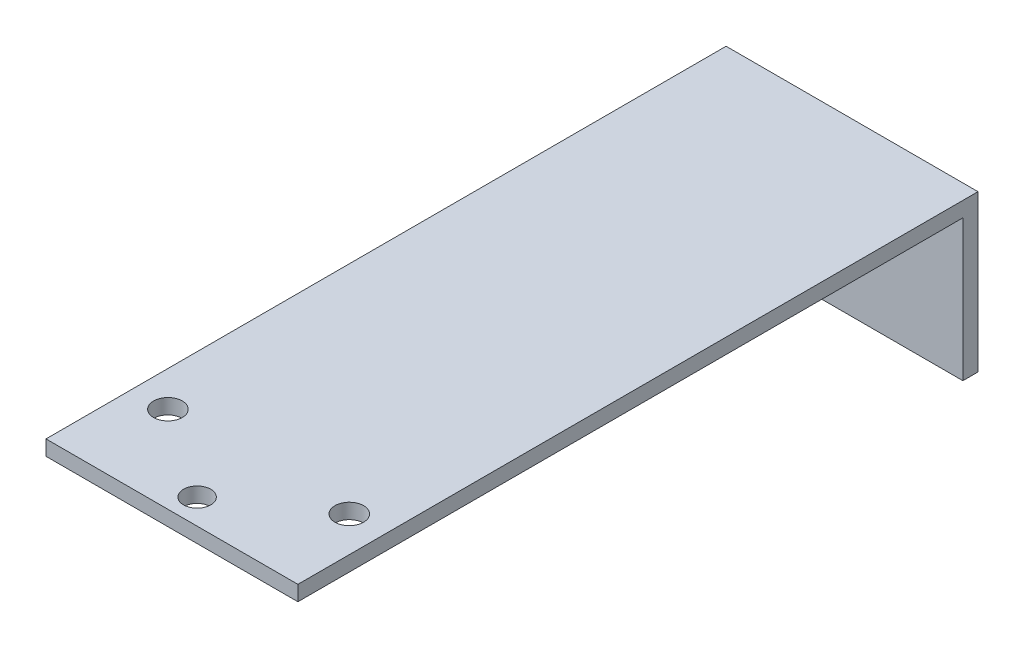
ISO-10303-21;
HEADER;
FILE_DESCRIPTION(('STEP AP214'),'2;1');
FILE_NAME('part.step','',(''),(''),'','','');
FILE_SCHEMA(('AUTOMOTIVE_DESIGN { 1 0 10303 214 1 1 1 1 }'));
ENDSEC;
DATA;
#1=APPLICATION_CONTEXT('core data for automotive mechanical design processes');
#2=APPLICATION_PROTOCOL_DEFINITION('international standard','automotive_design',2000,#1);
#3=PRODUCT_CONTEXT('',#1,'mechanical');
#4=PRODUCT('Part','Part','',(#3));
#5=PRODUCT_RELATED_PRODUCT_CATEGORY('part','',(#4));
#6=PRODUCT_DEFINITION_FORMATION('','',#4);
#7=PRODUCT_DEFINITION_CONTEXT('part definition',#1,'design');
#8=PRODUCT_DEFINITION('design','',#6,#7);
#9=PRODUCT_DEFINITION_SHAPE('','',#8);
#10=(LENGTH_UNIT() NAMED_UNIT(*) SI_UNIT(.MILLI.,.METRE.));
#11=(NAMED_UNIT(*) PLANE_ANGLE_UNIT() SI_UNIT($,.RADIAN.));
#12=(NAMED_UNIT(*) SI_UNIT($,.STERADIAN.) SOLID_ANGLE_UNIT());
#13=UNCERTAINTY_MEASURE_WITH_UNIT(LENGTH_MEASURE(1.E-05),#10,'distance_accuracy_value','');
#14=(GEOMETRIC_REPRESENTATION_CONTEXT(3) GLOBAL_UNCERTAINTY_ASSIGNED_CONTEXT((#13)) GLOBAL_UNIT_ASSIGNED_CONTEXT((#10,
#11,#12)) REPRESENTATION_CONTEXT('',''));
#15=CARTESIAN_POINT('',(0.,0.,0.));
#16=DIRECTION('',(0.,0.,1.));
#17=DIRECTION('',(1.,0.,0.));
#18=AXIS2_PLACEMENT_3D('',#15,#16,#17);
#19=CARTESIAN_POINT('',(0.,0.,0.));
#20=DIRECTION('',(0.,1.,0.));
#21=DIRECTION('',(0.,0.,1.));
#22=AXIS2_PLACEMENT_3D('',#19,#20,#21);
#23=PLANE('',#22);
#24=CARTESIAN_POINT('',(-40.4391805377721,0.,62.2878361075544));
#25=DIRECTION('',(0.,-1.,0.));
#26=DIRECTION('',(0.,0.,-1.));
#27=AXIS2_PLACEMENT_3D('',#24,#25,#26);
#28=CIRCLE('',#27,2.85);
#29=CARTESIAN_POINT('',(-40.4391805377721,0.,59.4378361075544));
#30=VERTEX_POINT('',#29);
#31=EDGE_CURVE('E151',#30,#30,#28,.T.);
#32=ORIENTED_EDGE('',*,*,#31,.F.);
#33=EDGE_LOOP('',(#32));
#34=FACE_BOUND('',#33,.T.);
#35=CARTESIAN_POINT('',(-4.43918053777207,0.,62.2878361075544));
#36=DIRECTION('',(0.,-1.,0.));
#37=DIRECTION('',(0.,0.,-1.));
#38=AXIS2_PLACEMENT_3D('',#35,#36,#37);
#39=CIRCLE('',#38,2.85);
#40=CARTESIAN_POINT('',(-4.43918053777207,0.,59.4378361075544));
#41=VERTEX_POINT('',#40);
#42=EDGE_CURVE('E156',#41,#41,#39,.T.);
#43=ORIENTED_EDGE('',*,*,#42,.F.);
#44=EDGE_LOOP('',(#43));
#45=FACE_BOUND('',#44,.T.);
#46=CARTESIAN_POINT('',(-22.4391805377721,0.,74.4878361075544));
#47=DIRECTION('',(0.,-1.,0.));
#48=DIRECTION('',(0.,0.,-1.));
#49=AXIS2_PLACEMENT_3D('',#46,#47,#48);
#50=CIRCLE('',#49,2.7);
#51=CARTESIAN_POINT('',(-22.4391805377721,0.,71.7878361075544));
#52=VERTEX_POINT('',#51);
#53=EDGE_CURVE('E126',#52,#52,#50,.T.);
#54=ORIENTED_EDGE('',*,*,#53,.F.);
#55=EDGE_LOOP('',(#54));
#56=FACE_BOUND('',#55,.T.);
#57=DIRECTION('',(-1.,0.,0.));
#58=VECTOR('',#57,1.);
#59=CARTESIAN_POINT('',(-47.4391805377721,0.,-52.5121638924456));
#60=LINE('',#59,#58);
#61=CARTESIAN_POINT('',(2.56081946222792,0.,-52.5121638924456));
#62=VERTEX_POINT('',#61);
#63=CARTESIAN_POINT('',(-47.4391805377721,0.,-52.5121638924456));
#64=VERTEX_POINT('',#63);
#65=EDGE_CURVE('E54',#62,#64,#60,.T.);
#66=ORIENTED_EDGE('',*,*,#65,.F.);
#67=DIRECTION('',(0.,0.,-1.));
#68=VECTOR('',#67,1.);
#69=CARTESIAN_POINT('',(2.56081946222791,0.,-55.5121638924456));
#70=LINE('',#69,#68);
#71=CARTESIAN_POINT('',(2.56081946222793,0.,79.4878361075544));
#72=VERTEX_POINT('',#71);
#73=EDGE_CURVE('E138',#72,#62,#70,.T.);
#74=ORIENTED_EDGE('',*,*,#73,.F.);
#75=DIRECTION('',(1.,0.,0.));
#76=VECTOR('',#75,1.);
#77=CARTESIAN_POINT('',(-47.4391805377721,0.,79.4878361075544));
#78=LINE('',#77,#76);
#79=CARTESIAN_POINT('',(-47.4391805377721,0.,79.4878361075544));
#80=VERTEX_POINT('',#79);
#81=EDGE_CURVE('E78',#80,#72,#78,.T.);
#82=ORIENTED_EDGE('',*,*,#81,.F.);
#83=DIRECTION('',(0.,0.,1.));
#84=VECTOR('',#83,1.);
#85=CARTESIAN_POINT('',(-47.4391805377721,0.,-55.5121638924456));
#86=LINE('',#85,#84);
#87=EDGE_CURVE('E136',#64,#80,#86,.T.);
#88=ORIENTED_EDGE('',*,*,#87,.F.);
#89=EDGE_LOOP('',(#66,#74,#82,#88));
#90=FACE_BOUND('',#89,.T.);
#91=ADVANCED_FACE('F37',(#34,#45,#56,#90),#23,.F.);
#92=CARTESIAN_POINT('',(-47.4391805377721,3.,-55.5121638924456));
#93=DIRECTION('',(1.,0.,0.));
#94=DIRECTION('',(0.,0.,-1.));
#95=AXIS2_PLACEMENT_3D('',#92,#93,#94);
#96=PLANE('',#95);
#97=DIRECTION('',(0.,-1.,0.));
#98=VECTOR('',#97,1.);
#99=CARTESIAN_POINT('',(-47.4391805377721,3.,-55.5121638924456));
#100=LINE('',#99,#98);
#101=CARTESIAN_POINT('',(-47.4391805377721,3.,-55.5121638924456));
#102=VERTEX_POINT('',#101);
#103=CARTESIAN_POINT('',(-47.4391805377721,-28.,-55.5121638924456));
#104=VERTEX_POINT('',#103);
#105=EDGE_CURVE('E100',#102,#104,#100,.T.);
#106=ORIENTED_EDGE('',*,*,#105,.T.);
#107=DIRECTION('',(0.,0.,-1.));
#108=VECTOR('',#107,1.);
#109=CARTESIAN_POINT('',(-47.4391805377721,-28.,-55.5121638924456));
#110=LINE('',#109,#108);
#111=CARTESIAN_POINT('',(-47.4391805377721,-28.,-52.5121638924456));
#112=VERTEX_POINT('',#111);
#113=EDGE_CURVE('E104',#112,#104,#110,.T.);
#114=ORIENTED_EDGE('',*,*,#113,.F.);
#115=DIRECTION('',(0.,1.,0.));
#116=VECTOR('',#115,1.);
#117=CARTESIAN_POINT('',(-47.4391805377721,-28.,-52.5121638924456));
#118=LINE('',#117,#116);
#119=EDGE_CURVE('E130',#112,#64,#118,.T.);
#120=ORIENTED_EDGE('',*,*,#119,.T.);
#121=ORIENTED_EDGE('',*,*,#87,.T.);
#122=DIRECTION('',(0.,-1.,0.));
#123=VECTOR('',#122,1.);
#124=CARTESIAN_POINT('',(-47.4391805377721,3.,79.4878361075544));
#125=LINE('',#124,#123);
#126=CARTESIAN_POINT('',(-47.4391805377721,3.,79.4878361075544));
#127=VERTEX_POINT('',#126);
#128=EDGE_CURVE('E11',#127,#80,#125,.T.);
#129=ORIENTED_EDGE('',*,*,#128,.F.);
#130=DIRECTION('',(0.,0.,1.));
#131=VECTOR('',#130,1.);
#132=CARTESIAN_POINT('',(-47.4391805377721,3.,-55.5121638924456));
#133=LINE('',#132,#131);
#134=EDGE_CURVE('E106',#102,#127,#133,.T.);
#135=ORIENTED_EDGE('',*,*,#134,.F.);
#136=EDGE_LOOP('',(#106,#114,#120,#121,#129,#135));
#137=FACE_BOUND('',#136,.T.);
#138=ADVANCED_FACE('F39',(#137),#96,.F.);
#139=CARTESIAN_POINT('',(-47.4391805377721,3.,79.4878361075544));
#140=DIRECTION('',(0.,0.,-1.));
#141=DIRECTION('',(-1.,0.,0.));
#142=AXIS2_PLACEMENT_3D('',#139,#140,#141);
#143=PLANE('',#142);
#144=ORIENTED_EDGE('',*,*,#81,.T.);
#145=DIRECTION('',(0.,-1.,0.));
#146=VECTOR('',#145,1.);
#147=CARTESIAN_POINT('',(2.56081946222793,3.,79.4878361075544));
#148=LINE('',#147,#146);
#149=CARTESIAN_POINT('',(2.56081946222793,3.,79.4878361075544));
#150=VERTEX_POINT('',#149);
#151=EDGE_CURVE('E46',#150,#72,#148,.T.);
#152=ORIENTED_EDGE('',*,*,#151,.F.);
#153=DIRECTION('',(1.,0.,0.));
#154=VECTOR('',#153,1.);
#155=CARTESIAN_POINT('',(-47.4391805377721,3.,79.4878361075544));
#156=LINE('',#155,#154);
#157=EDGE_CURVE('E83',#127,#150,#156,.T.);
#158=ORIENTED_EDGE('',*,*,#157,.F.);
#159=ORIENTED_EDGE('',*,*,#128,.T.);
#160=EDGE_LOOP('',(#144,#152,#158,#159));
#161=FACE_BOUND('',#160,.T.);
#162=ADVANCED_FACE('F197',(#161),#143,.F.);
#163=CARTESIAN_POINT('',(2.56081946222791,3.,-55.5121638924456));
#164=DIRECTION('',(-1.,0.,0.));
#165=DIRECTION('',(0.,0.,1.));
#166=AXIS2_PLACEMENT_3D('',#163,#164,#165);
#167=PLANE('',#166);
#168=ORIENTED_EDGE('',*,*,#73,.T.);
#169=DIRECTION('',(0.,1.,0.));
#170=VECTOR('',#169,1.);
#171=CARTESIAN_POINT('',(2.56081946222794,-28.,-52.5121638924456));
#172=LINE('',#171,#170);
#173=CARTESIAN_POINT('',(2.56081946222794,-28.,-52.5121638924456));
#174=VERTEX_POINT('',#173);
#175=EDGE_CURVE('E133',#174,#62,#172,.T.);
#176=ORIENTED_EDGE('',*,*,#175,.F.);
#177=DIRECTION('',(0.,0.,1.));
#178=VECTOR('',#177,1.);
#179=CARTESIAN_POINT('',(2.56081946222794,-28.,-55.5121638924456));
#180=LINE('',#179,#178);
#181=CARTESIAN_POINT('',(2.56081946222794,-28.,-55.5121638924456));
#182=VERTEX_POINT('',#181);
#183=EDGE_CURVE('E116',#182,#174,#180,.T.);
#184=ORIENTED_EDGE('',*,*,#183,.F.);
#185=DIRECTION('',(0.,-1.,0.));
#186=VECTOR('',#185,1.);
#187=CARTESIAN_POINT('',(2.56081946222791,3.,-55.5121638924456));
#188=LINE('',#187,#186);
#189=CARTESIAN_POINT('',(2.56081946222791,3.,-55.5121638924456));
#190=VERTEX_POINT('',#189);
#191=EDGE_CURVE('E108',#190,#182,#188,.T.);
#192=ORIENTED_EDGE('',*,*,#191,.F.);
#193=DIRECTION('',(0.,0.,-1.));
#194=VECTOR('',#193,1.);
#195=CARTESIAN_POINT('',(2.56081946222791,3.,-55.5121638924456));
#196=LINE('',#195,#194);
#197=EDGE_CURVE('E140',#150,#190,#196,.T.);
#198=ORIENTED_EDGE('',*,*,#197,.F.);
#199=ORIENTED_EDGE('',*,*,#151,.T.);
#200=EDGE_LOOP('',(#168,#176,#184,#192,#198,#199));
#201=FACE_BOUND('',#200,.T.);
#202=ADVANCED_FACE('F195',(#201),#167,.F.);
#203=CARTESIAN_POINT('',(-47.4391805377721,3.,-55.5121638924456));
#204=DIRECTION('',(0.,0.,1.));
#205=DIRECTION('',(1.,0.,0.));
#206=AXIS2_PLACEMENT_3D('',#203,#204,#205);
#207=PLANE('',#206);
#208=ORIENTED_EDGE('',*,*,#191,.T.);
#209=DIRECTION('',(1.,0.,0.));
#210=VECTOR('',#209,1.);
#211=CARTESIAN_POINT('',(-47.4391805377721,-28.,-55.5121638924456));
#212=LINE('',#211,#210);
#213=EDGE_CURVE('E111',#104,#182,#212,.T.);
#214=ORIENTED_EDGE('',*,*,#213,.F.);
#215=ORIENTED_EDGE('',*,*,#105,.F.);
#216=DIRECTION('',(-1.,0.,0.));
#217=VECTOR('',#216,1.);
#218=CARTESIAN_POINT('',(-47.4391805377721,3.,-55.5121638924456));
#219=LINE('',#218,#217);
#220=EDGE_CURVE('E63',#190,#102,#219,.T.);
#221=ORIENTED_EDGE('',*,*,#220,.F.);
#222=EDGE_LOOP('',(#208,#214,#215,#221));
#223=FACE_BOUND('',#222,.T.);
#224=ADVANCED_FACE('F112',(#223),#207,.F.);
#225=CARTESIAN_POINT('',(0.,3.,0.));
#226=DIRECTION('',(0.,1.,0.));
#227=DIRECTION('',(0.,0.,1.));
#228=AXIS2_PLACEMENT_3D('',#225,#226,#227);
#229=PLANE('',#228);
#230=CARTESIAN_POINT('',(-40.4391805377721,3.,62.2878361075544));
#231=DIRECTION('',(0.,1.,0.));
#232=DIRECTION('',(0.,0.,1.));
#233=AXIS2_PLACEMENT_3D('',#230,#231,#232);
#234=CIRCLE('',#233,2.85);
#235=CARTESIAN_POINT('',(-40.4391805377721,2.99999999999999,59.4378361075544));
#236=VERTEX_POINT('',#235);
#237=EDGE_CURVE('E41',#236,#236,#234,.T.);
#238=ORIENTED_EDGE('',*,*,#237,.F.);
#239=EDGE_LOOP('',(#238));
#240=FACE_BOUND('',#239,.T.);
#241=CARTESIAN_POINT('',(-4.43918053777207,3.,62.2878361075544));
#242=DIRECTION('',(0.,1.,0.));
#243=DIRECTION('',(0.,0.,1.));
#244=AXIS2_PLACEMENT_3D('',#241,#242,#243);
#245=CIRCLE('',#244,2.85);
#246=CARTESIAN_POINT('',(-4.43918053777207,2.99999999999999,59.4378361075544));
#247=VERTEX_POINT('',#246);
#248=EDGE_CURVE('E149',#247,#247,#245,.T.);
#249=ORIENTED_EDGE('',*,*,#248,.F.);
#250=EDGE_LOOP('',(#249));
#251=FACE_BOUND('',#250,.T.);
#252=CARTESIAN_POINT('',(-22.4391805377721,3.,74.4878361075544));
#253=DIRECTION('',(0.,1.,0.));
#254=DIRECTION('',(0.,0.,1.));
#255=AXIS2_PLACEMENT_3D('',#252,#253,#254);
#256=CIRCLE('',#255,2.7);
#257=CARTESIAN_POINT('',(-22.4391805377721,2.99999999999999,71.7878361075544));
#258=VERTEX_POINT('',#257);
#259=EDGE_CURVE('E123',#258,#258,#256,.T.);
#260=ORIENTED_EDGE('',*,*,#259,.F.);
#261=EDGE_LOOP('',(#260));
#262=FACE_BOUND('',#261,.T.);
#263=ORIENTED_EDGE('',*,*,#134,.T.);
#264=ORIENTED_EDGE('',*,*,#157,.T.);
#265=ORIENTED_EDGE('',*,*,#197,.T.);
#266=ORIENTED_EDGE('',*,*,#220,.T.);
#267=EDGE_LOOP('',(#263,#264,#265,#266));
#268=FACE_BOUND('',#267,.T.);
#269=ADVANCED_FACE('F188',(#240,#251,#262,#268),#229,.T.);
#270=CARTESIAN_POINT('',(-47.4391805377721,-28.,-52.5121638924456));
#271=DIRECTION('',(0.,0.,-1.));
#272=DIRECTION('',(-1.,0.,0.));
#273=AXIS2_PLACEMENT_3D('',#270,#271,#272);
#274=PLANE('',#273);
#275=ORIENTED_EDGE('',*,*,#65,.T.);
#276=ORIENTED_EDGE('',*,*,#119,.F.);
#277=DIRECTION('',(-1.,0.,0.));
#278=VECTOR('',#277,1.);
#279=CARTESIAN_POINT('',(-47.4391805377721,-28.,-52.5121638924456));
#280=LINE('',#279,#278);
#281=EDGE_CURVE('E120',#174,#112,#280,.T.);
#282=ORIENTED_EDGE('',*,*,#281,.F.);
#283=ORIENTED_EDGE('',*,*,#175,.T.);
#284=EDGE_LOOP('',(#275,#276,#282,#283));
#285=FACE_BOUND('',#284,.T.);
#286=ADVANCED_FACE('F182',(#285),#274,.F.);
#287=CARTESIAN_POINT('',(0.,-28.,0.));
#288=DIRECTION('',(0.,1.,0.));
#289=DIRECTION('',(0.,0.,1.));
#290=AXIS2_PLACEMENT_3D('',#287,#288,#289);
#291=PLANE('',#290);
#292=ORIENTED_EDGE('',*,*,#113,.T.);
#293=ORIENTED_EDGE('',*,*,#213,.T.);
#294=ORIENTED_EDGE('',*,*,#183,.T.);
#295=ORIENTED_EDGE('',*,*,#281,.T.);
#296=EDGE_LOOP('',(#292,#293,#294,#295));
#297=FACE_BOUND('',#296,.T.);
#298=ADVANCED_FACE('F118',(#297),#291,.F.);
#299=CARTESIAN_POINT('',(-22.4391805377721,90.,74.4878361075544));
#300=DIRECTION('',(0.,-1.,0.));
#301=DIRECTION('',(0.,0.,-1.));
#302=AXIS2_PLACEMENT_3D('',#299,#300,#301);
#303=CYLINDRICAL_SURFACE('',#302,2.7);
#304=CARTESIAN_POINT('',(-22.4391805377721,2.99999999999999,71.7878361075544));
#305=CARTESIAN_POINT('',(-22.4391805377721,2.96874999999999,71.7878361075544));
#306=CARTESIAN_POINT('',(-22.4391805377721,2.93749999999999,71.7878361075544));
#307=CARTESIAN_POINT('',(-22.4391805377721,2.87499999999999,71.7878361075544));
#308=CARTESIAN_POINT('',(-22.4391805377721,2.84374999999999,71.7878361075544));
#309=CARTESIAN_POINT('',(-22.4391805377721,2.78124999999999,71.7878361075544));
#310=CARTESIAN_POINT('',(-22.4391805377721,2.74999999999999,71.7878361075544));
#311=CARTESIAN_POINT('',(-22.4391805377721,2.68749999999999,71.7878361075544));
#312=CARTESIAN_POINT('',(-22.4391805377721,2.65624999999999,71.7878361075544));
#313=CARTESIAN_POINT('',(-22.4391805377721,2.59374999999999,71.7878361075544));
#314=CARTESIAN_POINT('',(-22.4391805377721,2.5625,71.7878361075544));
#315=CARTESIAN_POINT('',(-22.4391805377721,2.5,71.7878361075544));
#316=CARTESIAN_POINT('',(-22.4391805377721,2.46875,71.7878361075544));
#317=CARTESIAN_POINT('',(-22.4391805377721,2.40624999999999,71.7878361075544));
#318=CARTESIAN_POINT('',(-22.4391805377721,2.37499999999999,71.7878361075544));
#319=CARTESIAN_POINT('',(-22.4391805377721,2.31249999999999,71.7878361075544));
#320=CARTESIAN_POINT('',(-22.4391805377721,2.28124999999999,71.7878361075544));
#321=CARTESIAN_POINT('',(-22.4391805377721,2.21874999999999,71.7878361075544));
#322=CARTESIAN_POINT('',(-22.4391805377721,2.1875,71.7878361075544));
#323=CARTESIAN_POINT('',(-22.4391805377721,2.125,71.7878361075544));
#324=CARTESIAN_POINT('',(-22.4391805377721,2.09375,71.7878361075544));
#325=CARTESIAN_POINT('',(-22.4391805377721,2.03124999999999,71.7878361075544));
#326=CARTESIAN_POINT('',(-22.4391805377721,1.99999999999999,71.7878361075544));
#327=CARTESIAN_POINT('',(-22.4391805377721,1.93749999999999,71.7878361075544));
#328=CARTESIAN_POINT('',(-22.4391805377721,1.90625,71.7878361075544));
#329=CARTESIAN_POINT('',(-22.4391805377721,1.84375,71.7878361075544));
#330=CARTESIAN_POINT('',(-22.4391805377721,1.8125,71.7878361075544));
#331=CARTESIAN_POINT('',(-22.4391805377721,1.75,71.7878361075544));
#332=CARTESIAN_POINT('',(-22.4391805377721,1.71875,71.7878361075544));
#333=CARTESIAN_POINT('',(-22.4391805377721,1.65625,71.7878361075544));
#334=CARTESIAN_POINT('',(-22.4391805377721,1.625,71.7878361075544));
#335=CARTESIAN_POINT('',(-22.4391805377721,1.5625,71.7878361075544));
#336=CARTESIAN_POINT('',(-22.4391805377721,1.53125,71.7878361075544));
#337=CARTESIAN_POINT('',(-22.4391805377721,1.46875,71.7878361075544));
#338=CARTESIAN_POINT('',(-22.4391805377721,1.4375,71.7878361075544));
#339=CARTESIAN_POINT('',(-22.4391805377721,1.375,71.7878361075544));
#340=CARTESIAN_POINT('',(-22.4391805377721,1.34375,71.7878361075544));
#341=CARTESIAN_POINT('',(-22.4391805377721,1.28125000000001,71.7878361075544));
#342=CARTESIAN_POINT('',(-22.4391805377721,1.25000000000001,71.7878361075544));
#343=CARTESIAN_POINT('',(-22.4391805377721,1.1875,71.7878361075544));
#344=CARTESIAN_POINT('',(-22.4391805377721,1.15625,71.7878361075544));
#345=CARTESIAN_POINT('',(-22.4391805377721,1.09375,71.7878361075544));
#346=CARTESIAN_POINT('',(-22.4391805377721,1.06250000000001,71.7878361075544));
#347=CARTESIAN_POINT('',(-22.4391805377721,1.00000000000001,71.7878361075544));
#348=CARTESIAN_POINT('',(-22.4391805377721,0.968750000000009,71.7878361075544));
#349=CARTESIAN_POINT('',(-22.4391805377721,0.906250000000007,71.7878361075544));
#350=CARTESIAN_POINT('',(-22.4391805377721,0.875000000000005,71.7878361075544));
#351=CARTESIAN_POINT('',(-22.4391805377721,0.812500000000008,71.7878361075544));
#352=CARTESIAN_POINT('',(-22.4391805377721,0.781250000000011,71.7878361075544));
#353=CARTESIAN_POINT('',(-22.4391805377721,0.718750000000013,71.7878361075544));
#354=CARTESIAN_POINT('',(-22.4391805377721,0.687500000000012,71.7878361075544));
#355=CARTESIAN_POINT('',(-22.4391805377721,0.62500000000001,71.7878361075544));
#356=CARTESIAN_POINT('',(-22.4391805377721,0.593750000000009,71.7878361075544));
#357=CARTESIAN_POINT('',(-22.4391805377721,0.531250000000006,71.7878361075544));
#358=CARTESIAN_POINT('',(-22.4391805377721,0.500000000000005,71.7878361075544));
#359=CARTESIAN_POINT('',(-22.4391805377721,0.437500000000007,71.7878361075544));
#360=CARTESIAN_POINT('',(-22.4391805377721,0.406250000000011,71.7878361075544));
#361=CARTESIAN_POINT('',(-22.4391805377721,0.343750000000013,71.7878361075544));
#362=CARTESIAN_POINT('',(-22.4391805377721,0.312500000000012,71.7878361075544));
#363=CARTESIAN_POINT('',(-22.4391805377721,0.250000000000009,71.7878361075544));
#364=CARTESIAN_POINT('',(-22.4391805377721,0.218750000000008,71.7878361075544));
#365=CARTESIAN_POINT('',(-22.4391805377721,0.156250000000011,71.7878361075544));
#366=CARTESIAN_POINT('',(-22.4391805377721,0.125000000000014,71.7878361075544));
#367=CARTESIAN_POINT('',(-22.4391805377721,0.0625000000000162,71.7878361075544));
#368=CARTESIAN_POINT('',(-22.4391805377721,0.0312500000000151,71.7878361075544));
#369=CARTESIAN_POINT('',(-22.4391805377721,0.,71.7878361075544));
#370=B_SPLINE_CURVE_WITH_KNOTS('',3,(#304,#305,#306,#307,#308,#309,#310,#311,#312,#313,#314,
#315,#316,#317,#318,#319,#320,#321,#322,#323,#324,#325,#326,#327,#328,#329,#330,#331,#332,#333,
#334,#335,#336,#337,#338,#339,#340,#341,#342,#343,#344,#345,#346,#347,#348,#349,#350,#351,#352,
#353,#354,#355,#356,#357,#358,#359,#360,#361,#362,#363,#364,#365,#366,#367,#368,#369),
.UNSPECIFIED.,.F.,.F.,(4,2,2,2,2,2,2,2,2,2,2,2,2,2,2,2,2,2,2,2,2,2,2,2,2,2,2,2,2,2,2,2,4),(0.,
0.0937500000000036,0.187499999999993,0.281249999999997,0.375,0.46874999999999,0.562499999999994,
0.656249999999997,0.750000000000001,0.84374999999999,0.937499999999994,1.03125,1.12499999999999,
1.21874999999999,1.31249999999999,1.40624999999998,1.49999999999999,1.59374999999999,
1.68749999999998,1.78124999999998,1.87499999999999,1.96874999999998,2.06249999999998,
2.15624999999998,2.24999999999997,2.34374999999998,2.43749999999998,2.53124999999998,
2.62499999999997,2.71874999999998,2.81249999999998,2.90624999999997,2.99999999999998),.UNSPECIFIED.);
#371=EDGE_CURVE('BSEAM172',#258,#52,#370,.T.);
#372=ORIENTED_EDGE('',*,*,#259,.T.);
#373=ORIENTED_EDGE('',*,*,#53,.T.);
#374=ORIENTED_EDGE('',*,*,#371,.T.);
#375=ORIENTED_EDGE('',*,*,#371,.F.);
#376=EDGE_LOOP('',(#372,#374,#373,#375));
#377=FACE_BOUND('',#376,.T.);
#378=ADVANCED_FACE('F172',(#377),#303,.F.);
#379=CARTESIAN_POINT('',(-4.43918053777207,90.,62.2878361075544));
#380=DIRECTION('',(0.,-1.,0.));
#381=DIRECTION('',(0.,0.,-1.));
#382=AXIS2_PLACEMENT_3D('',#379,#380,#381);
#383=CYLINDRICAL_SURFACE('',#382,2.85);
#384=CARTESIAN_POINT('',(-4.43918053777207,2.99999999999999,59.4378361075544));
#385=CARTESIAN_POINT('',(-4.43918053777207,2.96874999999999,59.4378361075544));
#386=CARTESIAN_POINT('',(-4.43918053777207,2.93749999999999,59.4378361075544));
#387=CARTESIAN_POINT('',(-4.43918053777207,2.87499999999999,59.4378361075544));
#388=CARTESIAN_POINT('',(-4.43918053777207,2.84374999999999,59.4378361075544));
#389=CARTESIAN_POINT('',(-4.43918053777207,2.78124999999999,59.4378361075544));
#390=CARTESIAN_POINT('',(-4.43918053777207,2.74999999999999,59.4378361075544));
#391=CARTESIAN_POINT('',(-4.43918053777207,2.68749999999999,59.4378361075544));
#392=CARTESIAN_POINT('',(-4.43918053777207,2.65624999999999,59.4378361075544));
#393=CARTESIAN_POINT('',(-4.43918053777207,2.59374999999999,59.4378361075544));
#394=CARTESIAN_POINT('',(-4.43918053777207,2.5625,59.4378361075544));
#395=CARTESIAN_POINT('',(-4.43918053777207,2.5,59.4378361075544));
#396=CARTESIAN_POINT('',(-4.43918053777207,2.46875,59.4378361075544));
#397=CARTESIAN_POINT('',(-4.43918053777207,2.40624999999999,59.4378361075544));
#398=CARTESIAN_POINT('',(-4.43918053777207,2.37499999999999,59.4378361075544));
#399=CARTESIAN_POINT('',(-4.43918053777207,2.31249999999999,59.4378361075544));
#400=CARTESIAN_POINT('',(-4.43918053777207,2.28124999999999,59.4378361075544));
#401=CARTESIAN_POINT('',(-4.43918053777207,2.21874999999999,59.4378361075544));
#402=CARTESIAN_POINT('',(-4.43918053777207,2.1875,59.4378361075544));
#403=CARTESIAN_POINT('',(-4.43918053777207,2.125,59.4378361075544));
#404=CARTESIAN_POINT('',(-4.43918053777207,2.09375,59.4378361075544));
#405=CARTESIAN_POINT('',(-4.43918053777207,2.03124999999999,59.4378361075544));
#406=CARTESIAN_POINT('',(-4.43918053777207,1.99999999999999,59.4378361075544));
#407=CARTESIAN_POINT('',(-4.43918053777207,1.93749999999999,59.4378361075544));
#408=CARTESIAN_POINT('',(-4.43918053777207,1.90625,59.4378361075544));
#409=CARTESIAN_POINT('',(-4.43918053777207,1.84375,59.4378361075544));
#410=CARTESIAN_POINT('',(-4.43918053777207,1.8125,59.4378361075544));
#411=CARTESIAN_POINT('',(-4.43918053777207,1.75,59.4378361075544));
#412=CARTESIAN_POINT('',(-4.43918053777207,1.71875,59.4378361075544));
#413=CARTESIAN_POINT('',(-4.43918053777207,1.65625,59.4378361075544));
#414=CARTESIAN_POINT('',(-4.43918053777207,1.625,59.4378361075544));
#415=CARTESIAN_POINT('',(-4.43918053777207,1.5625,59.4378361075544));
#416=CARTESIAN_POINT('',(-4.43918053777207,1.53125,59.4378361075544));
#417=CARTESIAN_POINT('',(-4.43918053777207,1.46875,59.4378361075544));
#418=CARTESIAN_POINT('',(-4.43918053777207,1.4375,59.4378361075544));
#419=CARTESIAN_POINT('',(-4.43918053777207,1.375,59.4378361075544));
#420=CARTESIAN_POINT('',(-4.43918053777207,1.34375,59.4378361075544));
#421=CARTESIAN_POINT('',(-4.43918053777207,1.28125000000001,59.4378361075544));
#422=CARTESIAN_POINT('',(-4.43918053777207,1.25000000000001,59.4378361075544));
#423=CARTESIAN_POINT('',(-4.43918053777207,1.1875,59.4378361075544));
#424=CARTESIAN_POINT('',(-4.43918053777207,1.15625,59.4378361075544));
#425=CARTESIAN_POINT('',(-4.43918053777207,1.09375,59.4378361075544));
#426=CARTESIAN_POINT('',(-4.43918053777207,1.06250000000001,59.4378361075544));
#427=CARTESIAN_POINT('',(-4.43918053777207,1.00000000000001,59.4378361075544));
#428=CARTESIAN_POINT('',(-4.43918053777207,0.968750000000009,59.4378361075544));
#429=CARTESIAN_POINT('',(-4.43918053777207,0.906250000000007,59.4378361075544));
#430=CARTESIAN_POINT('',(-4.43918053777207,0.875000000000005,59.4378361075544));
#431=CARTESIAN_POINT('',(-4.43918053777207,0.812500000000008,59.4378361075544));
#432=CARTESIAN_POINT('',(-4.43918053777207,0.781250000000011,59.4378361075544));
#433=CARTESIAN_POINT('',(-4.43918053777207,0.718750000000013,59.4378361075544));
#434=CARTESIAN_POINT('',(-4.43918053777207,0.687500000000012,59.4378361075544));
#435=CARTESIAN_POINT('',(-4.43918053777207,0.62500000000001,59.4378361075544));
#436=CARTESIAN_POINT('',(-4.43918053777207,0.593750000000009,59.4378361075544));
#437=CARTESIAN_POINT('',(-4.43918053777207,0.531250000000006,59.4378361075544));
#438=CARTESIAN_POINT('',(-4.43918053777207,0.500000000000005,59.4378361075544));
#439=CARTESIAN_POINT('',(-4.43918053777207,0.437500000000007,59.4378361075544));
#440=CARTESIAN_POINT('',(-4.43918053777207,0.406250000000011,59.4378361075544));
#441=CARTESIAN_POINT('',(-4.43918053777207,0.343750000000013,59.4378361075544));
#442=CARTESIAN_POINT('',(-4.43918053777207,0.312500000000012,59.4378361075544));
#443=CARTESIAN_POINT('',(-4.43918053777207,0.250000000000009,59.4378361075544));
#444=CARTESIAN_POINT('',(-4.43918053777207,0.218750000000008,59.4378361075544));
#445=CARTESIAN_POINT('',(-4.43918053777207,0.156250000000011,59.4378361075544));
#446=CARTESIAN_POINT('',(-4.43918053777207,0.125000000000014,59.4378361075544));
#447=CARTESIAN_POINT('',(-4.43918053777207,0.0625000000000162,59.4378361075544));
#448=CARTESIAN_POINT('',(-4.43918053777207,0.0312500000000151,59.4378361075544));
#449=CARTESIAN_POINT('',(-4.43918053777207,0.,59.4378361075544));
#450=B_SPLINE_CURVE_WITH_KNOTS('',3,(#384,#385,#386,#387,#388,#389,#390,#391,#392,#393,#394,
#395,#396,#397,#398,#399,#400,#401,#402,#403,#404,#405,#406,#407,#408,#409,#410,#411,#412,#413,
#414,#415,#416,#417,#418,#419,#420,#421,#422,#423,#424,#425,#426,#427,#428,#429,#430,#431,#432,
#433,#434,#435,#436,#437,#438,#439,#440,#441,#442,#443,#444,#445,#446,#447,#448,#449),
.UNSPECIFIED.,.F.,.F.,(4,2,2,2,2,2,2,2,2,2,2,2,2,2,2,2,2,2,2,2,2,2,2,2,2,2,2,2,2,2,2,2,4),(0.,
0.0937500000000036,0.187499999999993,0.281249999999997,0.375,0.46874999999999,0.562499999999994,
0.656249999999997,0.750000000000001,0.84374999999999,0.937499999999994,1.03125,1.12499999999999,
1.21874999999999,1.31249999999999,1.40624999999998,1.49999999999999,1.59374999999999,
1.68749999999998,1.78124999999998,1.87499999999999,1.96874999999998,2.06249999999998,
2.15624999999998,2.24999999999997,2.34374999999998,2.43749999999998,2.53124999999998,
2.62499999999997,2.71874999999998,2.81249999999998,2.90624999999997,2.99999999999998),.UNSPECIFIED.);
#451=EDGE_CURVE('BSEAM163',#247,#41,#450,.T.);
#452=ORIENTED_EDGE('',*,*,#248,.T.);
#453=ORIENTED_EDGE('',*,*,#42,.T.);
#454=ORIENTED_EDGE('',*,*,#451,.T.);
#455=ORIENTED_EDGE('',*,*,#451,.F.);
#456=EDGE_LOOP('',(#452,#454,#453,#455));
#457=FACE_BOUND('',#456,.T.);
#458=ADVANCED_FACE('F163',(#457),#383,.F.);
#459=CARTESIAN_POINT('',(-40.4391805377721,90.,62.2878361075544));
#460=DIRECTION('',(0.,-1.,0.));
#461=DIRECTION('',(0.,0.,-1.));
#462=AXIS2_PLACEMENT_3D('',#459,#460,#461);
#463=CYLINDRICAL_SURFACE('',#462,2.85);
#464=CARTESIAN_POINT('',(-40.4391805377721,2.99999999999999,59.4378361075544));
#465=CARTESIAN_POINT('',(-40.4391805377721,2.96874999999999,59.4378361075544));
#466=CARTESIAN_POINT('',(-40.4391805377721,2.93749999999999,59.4378361075544));
#467=CARTESIAN_POINT('',(-40.4391805377721,2.87499999999999,59.4378361075544));
#468=CARTESIAN_POINT('',(-40.4391805377721,2.84374999999999,59.4378361075544));
#469=CARTESIAN_POINT('',(-40.4391805377721,2.78124999999999,59.4378361075544));
#470=CARTESIAN_POINT('',(-40.4391805377721,2.74999999999999,59.4378361075544));
#471=CARTESIAN_POINT('',(-40.4391805377721,2.68749999999999,59.4378361075544));
#472=CARTESIAN_POINT('',(-40.4391805377721,2.65624999999999,59.4378361075544));
#473=CARTESIAN_POINT('',(-40.4391805377721,2.59374999999999,59.4378361075544));
#474=CARTESIAN_POINT('',(-40.4391805377721,2.5625,59.4378361075544));
#475=CARTESIAN_POINT('',(-40.4391805377721,2.5,59.4378361075544));
#476=CARTESIAN_POINT('',(-40.4391805377721,2.46875,59.4378361075544));
#477=CARTESIAN_POINT('',(-40.4391805377721,2.40624999999999,59.4378361075544));
#478=CARTESIAN_POINT('',(-40.4391805377721,2.37499999999999,59.4378361075544));
#479=CARTESIAN_POINT('',(-40.4391805377721,2.31249999999999,59.4378361075544));
#480=CARTESIAN_POINT('',(-40.4391805377721,2.28124999999999,59.4378361075544));
#481=CARTESIAN_POINT('',(-40.4391805377721,2.21874999999999,59.4378361075544));
#482=CARTESIAN_POINT('',(-40.4391805377721,2.1875,59.4378361075544));
#483=CARTESIAN_POINT('',(-40.4391805377721,2.125,59.4378361075544));
#484=CARTESIAN_POINT('',(-40.4391805377721,2.09375,59.4378361075544));
#485=CARTESIAN_POINT('',(-40.4391805377721,2.03124999999999,59.4378361075544));
#486=CARTESIAN_POINT('',(-40.4391805377721,1.99999999999999,59.4378361075544));
#487=CARTESIAN_POINT('',(-40.4391805377721,1.93749999999999,59.4378361075544));
#488=CARTESIAN_POINT('',(-40.4391805377721,1.90625,59.4378361075544));
#489=CARTESIAN_POINT('',(-40.4391805377721,1.84375,59.4378361075544));
#490=CARTESIAN_POINT('',(-40.4391805377721,1.8125,59.4378361075544));
#491=CARTESIAN_POINT('',(-40.4391805377721,1.75,59.4378361075544));
#492=CARTESIAN_POINT('',(-40.4391805377721,1.71875,59.4378361075544));
#493=CARTESIAN_POINT('',(-40.4391805377721,1.65625,59.4378361075544));
#494=CARTESIAN_POINT('',(-40.4391805377721,1.625,59.4378361075544));
#495=CARTESIAN_POINT('',(-40.4391805377721,1.5625,59.4378361075544));
#496=CARTESIAN_POINT('',(-40.4391805377721,1.53125,59.4378361075544));
#497=CARTESIAN_POINT('',(-40.4391805377721,1.46875,59.4378361075544));
#498=CARTESIAN_POINT('',(-40.4391805377721,1.4375,59.4378361075544));
#499=CARTESIAN_POINT('',(-40.4391805377721,1.375,59.4378361075544));
#500=CARTESIAN_POINT('',(-40.4391805377721,1.34375,59.4378361075544));
#501=CARTESIAN_POINT('',(-40.4391805377721,1.28125000000001,59.4378361075544));
#502=CARTESIAN_POINT('',(-40.4391805377721,1.25000000000001,59.4378361075544));
#503=CARTESIAN_POINT('',(-40.4391805377721,1.1875,59.4378361075544));
#504=CARTESIAN_POINT('',(-40.4391805377721,1.15625,59.4378361075544));
#505=CARTESIAN_POINT('',(-40.4391805377721,1.09375,59.4378361075544));
#506=CARTESIAN_POINT('',(-40.4391805377721,1.06250000000001,59.4378361075544));
#507=CARTESIAN_POINT('',(-40.4391805377721,1.00000000000001,59.4378361075544));
#508=CARTESIAN_POINT('',(-40.4391805377721,0.968750000000009,59.4378361075544));
#509=CARTESIAN_POINT('',(-40.4391805377721,0.906250000000007,59.4378361075544));
#510=CARTESIAN_POINT('',(-40.4391805377721,0.875000000000005,59.4378361075544));
#511=CARTESIAN_POINT('',(-40.4391805377721,0.812500000000008,59.4378361075544));
#512=CARTESIAN_POINT('',(-40.4391805377721,0.781250000000011,59.4378361075544));
#513=CARTESIAN_POINT('',(-40.4391805377721,0.718750000000013,59.4378361075544));
#514=CARTESIAN_POINT('',(-40.4391805377721,0.687500000000012,59.4378361075544));
#515=CARTESIAN_POINT('',(-40.4391805377721,0.62500000000001,59.4378361075544));
#516=CARTESIAN_POINT('',(-40.4391805377721,0.593750000000009,59.4378361075544));
#517=CARTESIAN_POINT('',(-40.4391805377721,0.531250000000006,59.4378361075544));
#518=CARTESIAN_POINT('',(-40.4391805377721,0.500000000000005,59.4378361075544));
#519=CARTESIAN_POINT('',(-40.4391805377721,0.437500000000007,59.4378361075544));
#520=CARTESIAN_POINT('',(-40.4391805377721,0.406250000000011,59.4378361075544));
#521=CARTESIAN_POINT('',(-40.4391805377721,0.343750000000013,59.4378361075544));
#522=CARTESIAN_POINT('',(-40.4391805377721,0.312500000000012,59.4378361075544));
#523=CARTESIAN_POINT('',(-40.4391805377721,0.250000000000009,59.4378361075544));
#524=CARTESIAN_POINT('',(-40.4391805377721,0.218750000000008,59.4378361075544));
#525=CARTESIAN_POINT('',(-40.4391805377721,0.156250000000011,59.4378361075544));
#526=CARTESIAN_POINT('',(-40.4391805377721,0.125000000000014,59.4378361075544));
#527=CARTESIAN_POINT('',(-40.4391805377721,0.0625000000000162,59.4378361075544));
#528=CARTESIAN_POINT('',(-40.4391805377721,0.0312500000000151,59.4378361075544));
#529=CARTESIAN_POINT('',(-40.4391805377721,0.,59.4378361075544));
#530=B_SPLINE_CURVE_WITH_KNOTS('',3,(#464,#465,#466,#467,#468,#469,#470,#471,#472,#473,#474,
#475,#476,#477,#478,#479,#480,#481,#482,#483,#484,#485,#486,#487,#488,#489,#490,#491,#492,#493,
#494,#495,#496,#497,#498,#499,#500,#501,#502,#503,#504,#505,#506,#507,#508,#509,#510,#511,#512,
#513,#514,#515,#516,#517,#518,#519,#520,#521,#522,#523,#524,#525,#526,#527,#528,#529),
.UNSPECIFIED.,.F.,.F.,(4,2,2,2,2,2,2,2,2,2,2,2,2,2,2,2,2,2,2,2,2,2,2,2,2,2,2,2,2,2,2,2,4),(0.,
0.0937500000000036,0.187499999999993,0.281249999999997,0.375,0.46874999999999,0.562499999999994,
0.656249999999997,0.750000000000001,0.84374999999999,0.937499999999994,1.03125,1.12499999999999,
1.21874999999999,1.31249999999999,1.40624999999998,1.49999999999999,1.59374999999999,
1.68749999999998,1.78124999999998,1.87499999999999,1.96874999999998,2.06249999999998,
2.15624999999998,2.24999999999997,2.34374999999998,2.43749999999998,2.53124999999998,
2.62499999999997,2.71874999999998,2.81249999999998,2.90624999999997,2.99999999999998),.UNSPECIFIED.);
#531=EDGE_CURVE('BSEAM180',#236,#30,#530,.T.);
#532=ORIENTED_EDGE('',*,*,#237,.T.);
#533=ORIENTED_EDGE('',*,*,#31,.T.);
#534=ORIENTED_EDGE('',*,*,#531,.T.);
#535=ORIENTED_EDGE('',*,*,#531,.F.);
#536=EDGE_LOOP('',(#532,#534,#533,#535));
#537=FACE_BOUND('',#536,.T.);
#538=ADVANCED_FACE('F180',(#537),#463,.F.);
#539=CLOSED_SHELL('',(#91,#138,#162,#202,#224,#269,#286,#298,#378,#458,#538));
#540=MANIFOLD_SOLID_BREP('B2',#539);
#541=ADVANCED_BREP_SHAPE_REPRESENTATION('',(#18,#540),#14);
#542=SHAPE_DEFINITION_REPRESENTATION(#9,#541);
ENDSEC;
END-ISO-10303-21;
